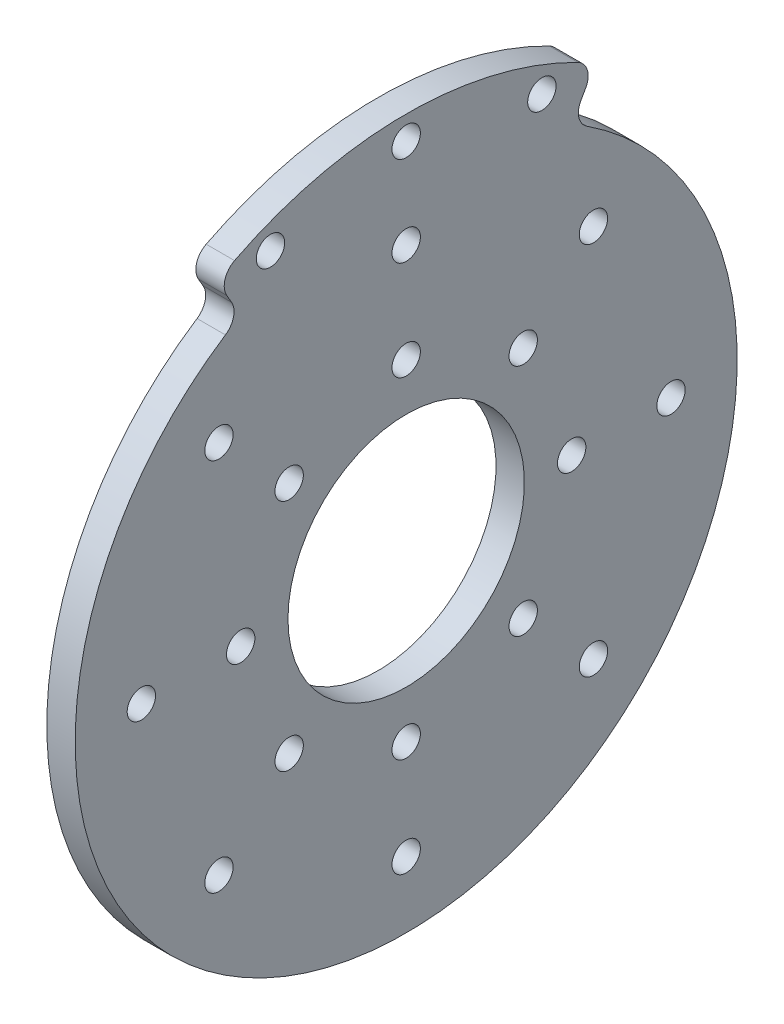
ISO-10303-21;
HEADER;
FILE_DESCRIPTION(('STEP AP214'),'2;1');
FILE_NAME('part.step','',(''),(''),'','','');
FILE_SCHEMA(('AUTOMOTIVE_DESIGN { 1 0 10303 214 1 1 1 1 }'));
ENDSEC;
DATA;
#1=APPLICATION_CONTEXT('core data for automotive mechanical design processes');
#2=APPLICATION_PROTOCOL_DEFINITION('international standard','automotive_design',2000,#1);
#3=PRODUCT_CONTEXT('',#1,'mechanical');
#4=PRODUCT('Part','Part','',(#3));
#5=PRODUCT_RELATED_PRODUCT_CATEGORY('part','',(#4));
#6=PRODUCT_DEFINITION_FORMATION('','',#4);
#7=PRODUCT_DEFINITION_CONTEXT('part definition',#1,'design');
#8=PRODUCT_DEFINITION('design','',#6,#7);
#9=PRODUCT_DEFINITION_SHAPE('','',#8);
#10=(LENGTH_UNIT() NAMED_UNIT(*) SI_UNIT(.MILLI.,.METRE.));
#11=(NAMED_UNIT(*) PLANE_ANGLE_UNIT() SI_UNIT($,.RADIAN.));
#12=(NAMED_UNIT(*) SI_UNIT($,.STERADIAN.) SOLID_ANGLE_UNIT());
#13=UNCERTAINTY_MEASURE_WITH_UNIT(LENGTH_MEASURE(1.E-05),#10,'distance_accuracy_value','');
#14=(GEOMETRIC_REPRESENTATION_CONTEXT(3) GLOBAL_UNCERTAINTY_ASSIGNED_CONTEXT((#13)) GLOBAL_UNIT_ASSIGNED_CONTEXT((#10,
#11,#12)) REPRESENTATION_CONTEXT('',''));
#15=CARTESIAN_POINT('',(0.,0.,0.));
#16=DIRECTION('',(0.,0.,1.));
#17=DIRECTION('',(1.,0.,0.));
#18=AXIS2_PLACEMENT_3D('',#15,#16,#17);
#19=CARTESIAN_POINT('',(0.,33.86335345031,-17.2416151534414));
#20=DIRECTION('',(1.,0.,0.));
#21=DIRECTION('',(0.,0.,-1.));
#22=AXIS2_PLACEMENT_3D('',#19,#20,#21);
#23=CYLINDRICAL_SURFACE('',#22,2.);
#24=DIRECTION('',(1.,0.,0.));
#25=VECTOR('',#24,1.);
#26=CARTESIAN_POINT('',(0.,35.6456352108526,-18.1490685825699));
#27=LINE('',#26,#25);
#28=CARTESIAN_POINT('',(3.,35.6456352108526,-18.1490685825699));
#29=VERTEX_POINT('',#28);
#30=CARTESIAN_POINT('',(0.,35.6456352108526,-18.1490685825699));
#31=VERTEX_POINT('',#30);
#32=EDGE_CURVE('E179',#29,#31,#27,.F.);
#33=ORIENTED_EDGE('',*,*,#32,.F.);
#34=CARTESIAN_POINT('',(3.,33.86335345031,-17.2416151534414));
#35=DIRECTION('',(1.,0.,0.));
#36=DIRECTION('',(0.,0.,-1.));
#37=AXIS2_PLACEMENT_3D('',#34,#35,#36);
#38=CIRCLE('',#37,2.);
#39=CARTESIAN_POINT('',(3.,32.86335345031,-18.9736659610103));
#40=VERTEX_POINT('',#39);
#41=EDGE_CURVE('E55',#40,#29,#38,.T.);
#42=ORIENTED_EDGE('',*,*,#41,.F.);
#43=DIRECTION('',(1.,0.,0.));
#44=VECTOR('',#43,1.);
#45=CARTESIAN_POINT('',(0.,32.8633534503099,-18.9736659610103));
#46=LINE('',#45,#44);
#47=CARTESIAN_POINT('',(0.,32.86335345031,-18.9736659610103));
#48=VERTEX_POINT('',#47);
#49=EDGE_CURVE('E182',#48,#40,#46,.T.);
#50=ORIENTED_EDGE('',*,*,#49,.F.);
#51=CARTESIAN_POINT('',(0.,33.86335345031,-17.2416151534414));
#52=DIRECTION('',(1.,0.,0.));
#53=DIRECTION('',(0.,0.,-1.));
#54=AXIS2_PLACEMENT_3D('',#51,#52,#53);
#55=CIRCLE('',#54,2.);
#56=EDGE_CURVE('E11',#31,#48,#55,.F.);
#57=ORIENTED_EDGE('',*,*,#56,.F.);
#58=EDGE_LOOP('',(#33,#42,#50,#57));
#59=FACE_BOUND('',#58,.T.);
#60=ADVANCED_FACE('F47',(#59),#23,.T.);
#61=CARTESIAN_POINT('',(3.,30.9960935115523,-20.2050040094801));
#62=DIRECTION('',(-1.,0.,0.));
#63=DIRECTION('',(0.,0.,1.));
#64=AXIS2_PLACEMENT_3D('',#61,#62,#63);
#65=CYLINDRICAL_SURFACE('',#64,2.);
#66=DIRECTION('',(-1.,0.,0.));
#67=VECTOR('',#66,1.);
#68=CARTESIAN_POINT('',(0.,31.9960935115523,-18.4729532019112));
#69=LINE('',#68,#67);
#70=CARTESIAN_POINT('',(3.,31.9960935115523,-18.4729532019112));
#71=VERTEX_POINT('',#70);
#72=CARTESIAN_POINT('',(0.,31.9960935115523,-18.4729532019112));
#73=VERTEX_POINT('',#72);
#74=EDGE_CURVE('E165',#71,#73,#69,.T.);
#75=ORIENTED_EDGE('',*,*,#74,.F.);
#76=CARTESIAN_POINT('',(3.,30.9960935115523,-20.2050040094801));
#77=DIRECTION('',(1.,0.,0.));
#78=DIRECTION('',(0.,0.,-1.));
#79=AXIS2_PLACEMENT_3D('',#76,#77,#78);
#80=CIRCLE('',#79,2.);
#81=CARTESIAN_POINT('',(3.,29.3206289974143,-19.1128416305893));
#82=VERTEX_POINT('',#81);
#83=EDGE_CURVE('E173',#71,#82,#80,.T.);
#84=ORIENTED_EDGE('',*,*,#83,.T.);
#85=DIRECTION('',(-1.,0.,0.));
#86=VECTOR('',#85,1.);
#87=CARTESIAN_POINT('',(3.,29.3206289974143,-19.1128416305893));
#88=LINE('',#87,#86);
#89=CARTESIAN_POINT('',(0.,29.3206289974143,-19.1128416305893));
#90=VERTEX_POINT('',#89);
#91=EDGE_CURVE('E169',#90,#82,#88,.F.);
#92=ORIENTED_EDGE('',*,*,#91,.F.);
#93=CARTESIAN_POINT('',(0.,30.9960935115523,-20.2050040094801));
#94=DIRECTION('',(1.,0.,0.));
#95=DIRECTION('',(0.,0.,-1.));
#96=AXIS2_PLACEMENT_3D('',#93,#94,#95);
#97=CIRCLE('',#96,2.);
#98=EDGE_CURVE('E176',#90,#73,#97,.F.);
#99=ORIENTED_EDGE('',*,*,#98,.T.);
#100=EDGE_LOOP('',(#75,#84,#92,#99));
#101=FACE_BOUND('',#100,.T.);
#102=ADVANCED_FACE('F361',(#101),#65,.F.);
#103=CARTESIAN_POINT('',(3.,30.9960935115523,20.2050040094801));
#104=DIRECTION('',(-1.,0.,0.));
#105=DIRECTION('',(0.,0.,1.));
#106=AXIS2_PLACEMENT_3D('',#103,#104,#105);
#107=CYLINDRICAL_SURFACE('',#106,2.);
#108=DIRECTION('',(1.,0.,0.));
#109=VECTOR('',#108,1.);
#110=CARTESIAN_POINT('',(3.,31.9960935115523,18.4729532019112));
#111=LINE('',#110,#109);
#112=CARTESIAN_POINT('',(0.,31.9960935115523,18.4729532019112));
#113=VERTEX_POINT('',#112);
#114=CARTESIAN_POINT('',(3.,31.9960935115523,18.4729532019112));
#115=VERTEX_POINT('',#114);
#116=EDGE_CURVE('E133',#113,#115,#111,.T.);
#117=ORIENTED_EDGE('',*,*,#116,.F.);
#118=CARTESIAN_POINT('',(0.,30.9960935115523,20.2050040094801));
#119=DIRECTION('',(1.,0.,0.));
#120=DIRECTION('',(0.,0.,-1.));
#121=AXIS2_PLACEMENT_3D('',#118,#119,#120);
#122=CIRCLE('',#121,2.);
#123=CARTESIAN_POINT('',(0.,29.3206289974143,19.1128416305893));
#124=VERTEX_POINT('',#123);
#125=EDGE_CURVE('E159',#113,#124,#122,.F.);
#126=ORIENTED_EDGE('',*,*,#125,.T.);
#127=DIRECTION('',(-1.,0.,0.));
#128=VECTOR('',#127,1.);
#129=CARTESIAN_POINT('',(3.,29.3206289974143,19.1128416305893));
#130=LINE('',#129,#128);
#131=CARTESIAN_POINT('',(3.,29.3206289974143,19.1128416305893));
#132=VERTEX_POINT('',#131);
#133=EDGE_CURVE('E155',#132,#124,#130,.T.);
#134=ORIENTED_EDGE('',*,*,#133,.F.);
#135=CARTESIAN_POINT('',(3.,30.9960935115523,20.2050040094801));
#136=DIRECTION('',(1.,0.,0.));
#137=DIRECTION('',(0.,0.,-1.));
#138=AXIS2_PLACEMENT_3D('',#135,#136,#137);
#139=CIRCLE('',#138,2.);
#140=EDGE_CURVE('E162',#132,#115,#139,.T.);
#141=ORIENTED_EDGE('',*,*,#140,.T.);
#142=EDGE_LOOP('',(#117,#126,#134,#141));
#143=FACE_BOUND('',#142,.T.);
#144=ADVANCED_FACE('F366',(#143),#107,.F.);
#145=CARTESIAN_POINT('',(0.,33.8633534503099,17.2416151534414));
#146=DIRECTION('',(1.,0.,0.));
#147=DIRECTION('',(0.,0.,-1.));
#148=AXIS2_PLACEMENT_3D('',#145,#146,#147);
#149=CYLINDRICAL_SURFACE('',#148,2.);
#150=DIRECTION('',(1.,0.,0.));
#151=VECTOR('',#150,1.);
#152=CARTESIAN_POINT('',(0.,35.6456352108526,18.1490685825699));
#153=LINE('',#152,#151);
#154=CARTESIAN_POINT('',(0.,35.6456352108526,18.1490685825699));
#155=VERTEX_POINT('',#154);
#156=CARTESIAN_POINT('',(3.,35.6456352108526,18.1490685825699));
#157=VERTEX_POINT('',#156);
#158=EDGE_CURVE('E129',#155,#157,#153,.T.);
#159=ORIENTED_EDGE('',*,*,#158,.F.);
#160=CARTESIAN_POINT('',(0.,33.8633534503099,17.2416151534414));
#161=DIRECTION('',(1.,0.,0.));
#162=DIRECTION('',(0.,0.,-1.));
#163=AXIS2_PLACEMENT_3D('',#160,#161,#162);
#164=CIRCLE('',#163,2.);
#165=CARTESIAN_POINT('',(0.,32.8633534503099,18.9736659610103));
#166=VERTEX_POINT('',#165);
#167=EDGE_CURVE('E134',#166,#155,#164,.F.);
#168=ORIENTED_EDGE('',*,*,#167,.F.);
#169=DIRECTION('',(-1.,0.,0.));
#170=VECTOR('',#169,1.);
#171=CARTESIAN_POINT('',(0.,32.8633534503099,18.9736659610103));
#172=LINE('',#171,#170);
#173=CARTESIAN_POINT('',(3.,32.8633534503099,18.9736659610103));
#174=VERTEX_POINT('',#173);
#175=EDGE_CURVE('E131',#174,#166,#172,.T.);
#176=ORIENTED_EDGE('',*,*,#175,.F.);
#177=CARTESIAN_POINT('',(3.,33.8633534503099,17.2416151534414));
#178=DIRECTION('',(1.,0.,0.));
#179=DIRECTION('',(0.,0.,-1.));
#180=AXIS2_PLACEMENT_3D('',#177,#178,#179);
#181=CIRCLE('',#180,2.);
#182=EDGE_CURVE('E116',#157,#174,#181,.T.);
#183=ORIENTED_EDGE('',*,*,#182,.F.);
#184=EDGE_LOOP('',(#159,#168,#176,#183));
#185=FACE_BOUND('',#184,.T.);
#186=ADVANCED_FACE('F127',(#185),#149,.T.);
#187=CARTESIAN_POINT('',(3.,0.,0.));
#188=DIRECTION('',(-1.,0.,0.));
#189=DIRECTION('',(0.,0.,1.));
#190=AXIS2_PLACEMENT_3D('',#187,#188,#189);
#191=CYLINDRICAL_SURFACE('',#190,35.);
#192=CARTESIAN_POINT('',(0.,0.,0.));
#193=DIRECTION('',(1.,0.,0.));
#194=DIRECTION('',(0.,0.,-1.));
#195=AXIS2_PLACEMENT_3D('',#192,#193,#194);
#196=CIRCLE('',#195,35.);
#197=EDGE_CURVE('E146',#124,#90,#196,.T.);
#198=ORIENTED_EDGE('',*,*,#197,.T.);
#199=ORIENTED_EDGE('',*,*,#91,.T.);
#200=CARTESIAN_POINT('',(3.,0.,0.));
#201=DIRECTION('',(1.,0.,0.));
#202=DIRECTION('',(0.,0.,-1.));
#203=AXIS2_PLACEMENT_3D('',#200,#201,#202);
#204=CIRCLE('',#203,35.);
#205=EDGE_CURVE('E140',#132,#82,#204,.T.);
#206=ORIENTED_EDGE('',*,*,#205,.F.);
#207=ORIENTED_EDGE('',*,*,#133,.T.);
#208=EDGE_LOOP('',(#198,#199,#206,#207));
#209=FACE_BOUND('',#208,.T.);
#210=ADVANCED_FACE('F345',(#209),#191,.T.);
#211=CARTESIAN_POINT('',(3.,0.,0.));
#212=DIRECTION('',(1.,0.,0.));
#213=DIRECTION('',(0.,0.,-1.));
#214=AXIS2_PLACEMENT_3D('',#211,#212,#213);
#215=PLANE('',#214);
#216=CARTESIAN_POINT('',(3.,34.6454824691735,14.3506287136904));
#217=DIRECTION('',(1.,0.,0.));
#218=DIRECTION('',(0.,0.,-1.));
#219=AXIS2_PLACEMENT_3D('',#216,#217,#218);
#220=CIRCLE('',#219,1.5);
#221=CARTESIAN_POINT('',(3.,34.6454824691735,12.8506287136904));
#222=VERTEX_POINT('',#221);
#223=EDGE_CURVE('E196',#222,#222,#220,.T.);
#224=ORIENTED_EDGE('',*,*,#223,.F.);
#225=EDGE_LOOP('',(#224));
#226=FACE_BOUND('',#225,.T.);
#227=CARTESIAN_POINT('',(3.,34.6454824691732,-14.3506287136909));
#228=DIRECTION('',(1.,0.,0.));
#229=DIRECTION('',(0.,0.,-1.));
#230=AXIS2_PLACEMENT_3D('',#227,#228,#229);
#231=CIRCLE('',#230,1.5);
#232=CARTESIAN_POINT('',(3.,34.6454824691732,-15.8506287136909));
#233=VERTEX_POINT('',#232);
#234=EDGE_CURVE('E382',#233,#233,#231,.T.);
#235=ORIENTED_EDGE('',*,*,#234,.F.);
#236=EDGE_LOOP('',(#235));
#237=FACE_BOUND('',#236,.T.);
#238=CARTESIAN_POINT('',(3.,37.5,0.));
#239=DIRECTION('',(1.,0.,0.));
#240=DIRECTION('',(0.,0.,-1.));
#241=AXIS2_PLACEMENT_3D('',#238,#239,#240);
#242=CIRCLE('',#241,1.5);
#243=CARTESIAN_POINT('',(3.,37.5,-1.5));
#244=VERTEX_POINT('',#243);
#245=EDGE_CURVE('E374',#244,#244,#242,.T.);
#246=ORIENTED_EDGE('',*,*,#245,.F.);
#247=EDGE_LOOP('',(#246));
#248=FACE_BOUND('',#247,.T.);
#249=DIRECTION('',(0.,0.866025403784438,-0.500000000000001));
#250=VECTOR('',#249,1.);
#251=CARTESIAN_POINT('',(3.,0.,0.));
#252=LINE('',#251,#250);
#253=EDGE_CURVE('E123',#71,#40,#252,.T.);
#254=ORIENTED_EDGE('',*,*,#253,.T.);
#255=ORIENTED_EDGE('',*,*,#41,.T.);
#256=CARTESIAN_POINT('',(3.,0.,0.));
#257=DIRECTION('',(1.,0.,0.));
#258=DIRECTION('',(0.,0.,-1.));
#259=AXIS2_PLACEMENT_3D('',#256,#257,#258);
#260=CIRCLE('',#259,40.);
#261=EDGE_CURVE('E110',#29,#157,#260,.T.);
#262=ORIENTED_EDGE('',*,*,#261,.T.);
#263=ORIENTED_EDGE('',*,*,#182,.T.);
#264=DIRECTION('',(0.,0.866025403784438,0.500000000000001));
#265=VECTOR('',#264,1.);
#266=CARTESIAN_POINT('',(3.,0.,0.));
#267=LINE('',#266,#265);
#268=EDGE_CURVE('E122',#115,#174,#267,.T.);
#269=ORIENTED_EDGE('',*,*,#268,.F.);
#270=ORIENTED_EDGE('',*,*,#140,.F.);
#271=ORIENTED_EDGE('',*,*,#205,.T.);
#272=ORIENTED_EDGE('',*,*,#83,.F.);
#273=EDGE_LOOP('',(#254,#255,#262,#263,#269,#270,#271,#272));
#274=FACE_BOUND('',#273,.T.);
#275=CARTESIAN_POINT('',(3.,0.,0.));
#276=DIRECTION('',(-1.,0.,0.));
#277=DIRECTION('',(0.,0.,1.));
#278=AXIS2_PLACEMENT_3D('',#275,#276,#277);
#279=CIRCLE('',#278,12.5);
#280=CARTESIAN_POINT('',(3.,0.,12.5));
#281=VERTEX_POINT('',#280);
#282=EDGE_CURVE('E204',#281,#281,#279,.T.);
#283=ORIENTED_EDGE('',*,*,#282,.T.);
#284=EDGE_LOOP('',(#283));
#285=FACE_BOUND('',#284,.T.);
#286=CARTESIAN_POINT('',(3.,17.5,0.));
#287=DIRECTION('',(1.,0.,0.));
#288=DIRECTION('',(0.,0.,-1.));
#289=AXIS2_PLACEMENT_3D('',#286,#287,#288);
#290=CIRCLE('',#289,1.5);
#291=CARTESIAN_POINT('',(3.,17.5,-1.5));
#292=VERTEX_POINT('',#291);
#293=EDGE_CURVE('E237',#292,#292,#290,.T.);
#294=ORIENTED_EDGE('',*,*,#293,.F.);
#295=EDGE_LOOP('',(#294));
#296=FACE_BOUND('',#295,.T.);
#297=CARTESIAN_POINT('',(3.,12.3743686707646,-12.3743686707646));
#298=DIRECTION('',(1.,0.,0.));
#299=DIRECTION('',(0.,0.,-1.));
#300=AXIS2_PLACEMENT_3D('',#297,#298,#299);
#301=CIRCLE('',#300,1.5);
#302=CARTESIAN_POINT('',(3.,12.3743686707646,-13.8743686707646));
#303=VERTEX_POINT('',#302);
#304=EDGE_CURVE('E246',#303,#303,#301,.T.);
#305=ORIENTED_EDGE('',*,*,#304,.F.);
#306=EDGE_LOOP('',(#305));
#307=FACE_BOUND('',#306,.T.);
#308=CARTESIAN_POINT('',(3.,0.,-17.5));
#309=DIRECTION('',(1.,0.,0.));
#310=DIRECTION('',(0.,0.,-1.));
#311=AXIS2_PLACEMENT_3D('',#308,#309,#310);
#312=CIRCLE('',#311,1.5);
#313=CARTESIAN_POINT('',(3.,0.,-19.));
#314=VERTEX_POINT('',#313);
#315=EDGE_CURVE('E254',#314,#314,#312,.T.);
#316=ORIENTED_EDGE('',*,*,#315,.F.);
#317=EDGE_LOOP('',(#316));
#318=FACE_BOUND('',#317,.T.);
#319=CARTESIAN_POINT('',(3.,-12.3743686707646,-12.3743686707645));
#320=DIRECTION('',(1.,0.,0.));
#321=DIRECTION('',(0.,0.,-1.));
#322=AXIS2_PLACEMENT_3D('',#319,#320,#321);
#323=CIRCLE('',#322,1.5);
#324=CARTESIAN_POINT('',(3.,-12.3743686707646,-13.8743686707645));
#325=VERTEX_POINT('',#324);
#326=EDGE_CURVE('E262',#325,#325,#323,.T.);
#327=ORIENTED_EDGE('',*,*,#326,.F.);
#328=EDGE_LOOP('',(#327));
#329=FACE_BOUND('',#328,.T.);
#330=CARTESIAN_POINT('',(3.,-17.5,1.2220184685951E-13));
#331=DIRECTION('',(1.,0.,0.));
#332=DIRECTION('',(0.,0.,-1.));
#333=AXIS2_PLACEMENT_3D('',#330,#331,#332);
#334=CIRCLE('',#333,1.5);
#335=CARTESIAN_POINT('',(3.,-17.5,-1.49999999999988));
#336=VERTEX_POINT('',#335);
#337=EDGE_CURVE('E213',#336,#336,#334,.T.);
#338=ORIENTED_EDGE('',*,*,#337,.F.);
#339=EDGE_LOOP('',(#338));
#340=FACE_BOUND('',#339,.T.);
#341=CARTESIAN_POINT('',(3.,-12.3743686707645,12.3743686707647));
#342=DIRECTION('',(1.,0.,0.));
#343=DIRECTION('',(0.,0.,-1.));
#344=AXIS2_PLACEMENT_3D('',#341,#342,#343);
#345=CIRCLE('',#344,1.5);
#346=CARTESIAN_POINT('',(3.,-12.3743686707645,10.8743686707647));
#347=VERTEX_POINT('',#346);
#348=EDGE_CURVE('E222',#347,#347,#345,.T.);
#349=ORIENTED_EDGE('',*,*,#348,.F.);
#350=EDGE_LOOP('',(#349));
#351=FACE_BOUND('',#350,.T.);
#352=CARTESIAN_POINT('',(3.,1.83302770289265E-13,17.5));
#353=DIRECTION('',(1.,0.,0.));
#354=DIRECTION('',(0.,0.,-1.));
#355=AXIS2_PLACEMENT_3D('',#352,#353,#354);
#356=CIRCLE('',#355,1.5);
#357=CARTESIAN_POINT('',(3.,1.83302770289265E-13,16.));
#358=VERTEX_POINT('',#357);
#359=EDGE_CURVE('E230',#358,#358,#356,.T.);
#360=ORIENTED_EDGE('',*,*,#359,.F.);
#361=EDGE_LOOP('',(#360));
#362=FACE_BOUND('',#361,.T.);
#363=CARTESIAN_POINT('',(3.,12.3743686707647,12.3743686707644));
#364=DIRECTION('',(1.,0.,0.));
#365=DIRECTION('',(0.,0.,-1.));
#366=AXIS2_PLACEMENT_3D('',#363,#364,#365);
#367=CIRCLE('',#366,1.5);
#368=CARTESIAN_POINT('',(3.,12.3743686707647,10.8743686707644));
#369=VERTEX_POINT('',#368);
#370=EDGE_CURVE('E241',#369,#369,#367,.T.);
#371=ORIENTED_EDGE('',*,*,#370,.F.);
#372=EDGE_LOOP('',(#371));
#373=FACE_BOUND('',#372,.T.);
#374=CARTESIAN_POINT('',(3.,-19.7989898732234,-19.7989898732232));
#375=DIRECTION('',(1.,0.,0.));
#376=DIRECTION('',(0.,0.,-1.));
#377=AXIS2_PLACEMENT_3D('',#374,#375,#376);
#378=CIRCLE('',#377,1.5);
#379=CARTESIAN_POINT('',(3.,-19.7989898732234,-21.2989898732232));
#380=VERTEX_POINT('',#379);
#381=EDGE_CURVE('E301',#380,#380,#378,.T.);
#382=ORIENTED_EDGE('',*,*,#381,.F.);
#383=EDGE_LOOP('',(#382));
#384=FACE_BOUND('',#383,.T.);
#385=CARTESIAN_POINT('',(3.,-28.,1.95522954975215E-13));
#386=DIRECTION('',(1.,0.,0.));
#387=DIRECTION('',(0.,0.,-1.));
#388=AXIS2_PLACEMENT_3D('',#385,#386,#387);
#389=CIRCLE('',#388,1.5);
#390=CARTESIAN_POINT('',(3.,-28.,-1.4999999999998));
#391=VERTEX_POINT('',#390);
#392=EDGE_CURVE('E310',#391,#391,#389,.T.);
#393=ORIENTED_EDGE('',*,*,#392,.F.);
#394=EDGE_LOOP('',(#393));
#395=FACE_BOUND('',#394,.T.);
#396=CARTESIAN_POINT('',(3.,-19.7989898732232,19.7989898732235));
#397=DIRECTION('',(1.,0.,0.));
#398=DIRECTION('',(0.,0.,-1.));
#399=AXIS2_PLACEMENT_3D('',#396,#397,#398);
#400=CIRCLE('',#399,1.5);
#401=CARTESIAN_POINT('',(3.,-19.7989898732232,18.2989898732235));
#402=VERTEX_POINT('',#401);
#403=EDGE_CURVE('E318',#402,#402,#400,.T.);
#404=ORIENTED_EDGE('',*,*,#403,.F.);
#405=EDGE_LOOP('',(#404));
#406=FACE_BOUND('',#405,.T.);
#407=CARTESIAN_POINT('',(3.,2.93284432462823E-13,28.));
#408=DIRECTION('',(1.,0.,0.));
#409=DIRECTION('',(0.,0.,-1.));
#410=AXIS2_PLACEMENT_3D('',#407,#408,#409);
#411=CIRCLE('',#410,1.5);
#412=CARTESIAN_POINT('',(3.,2.93284432462823E-13,26.5));
#413=VERTEX_POINT('',#412);
#414=EDGE_CURVE('E326',#413,#413,#411,.T.);
#415=ORIENTED_EDGE('',*,*,#414,.F.);
#416=EDGE_LOOP('',(#415));
#417=FACE_BOUND('',#416,.T.);
#418=CARTESIAN_POINT('',(3.,28.,0.));
#419=DIRECTION('',(1.,0.,0.));
#420=DIRECTION('',(0.,0.,-1.));
#421=AXIS2_PLACEMENT_3D('',#418,#419,#420);
#422=CIRCLE('',#421,1.5);
#423=CARTESIAN_POINT('',(3.,28.,-1.5));
#424=VERTEX_POINT('',#423);
#425=EDGE_CURVE('E277',#424,#424,#422,.T.);
#426=ORIENTED_EDGE('',*,*,#425,.F.);
#427=EDGE_LOOP('',(#426));
#428=FACE_BOUND('',#427,.T.);
#429=CARTESIAN_POINT('',(3.,19.7989898732233,-19.7989898732234));
#430=DIRECTION('',(1.,0.,0.));
#431=DIRECTION('',(0.,0.,-1.));
#432=AXIS2_PLACEMENT_3D('',#429,#430,#431);
#433=CIRCLE('',#432,1.5);
#434=CARTESIAN_POINT('',(3.,19.7989898732233,-21.2989898732234));
#435=VERTEX_POINT('',#434);
#436=EDGE_CURVE('E286',#435,#435,#433,.T.);
#437=ORIENTED_EDGE('',*,*,#436,.F.);
#438=EDGE_LOOP('',(#437));
#439=FACE_BOUND('',#438,.T.);
#440=CARTESIAN_POINT('',(3.,0.,-28.));
#441=DIRECTION('',(1.,0.,0.));
#442=DIRECTION('',(0.,0.,-1.));
#443=AXIS2_PLACEMENT_3D('',#440,#441,#442);
#444=CIRCLE('',#443,1.5);
#445=CARTESIAN_POINT('',(3.,0.,-29.5));
#446=VERTEX_POINT('',#445);
#447=EDGE_CURVE('E294',#446,#446,#444,.T.);
#448=ORIENTED_EDGE('',*,*,#447,.F.);
#449=EDGE_LOOP('',(#448));
#450=FACE_BOUND('',#449,.T.);
#451=CARTESIAN_POINT('',(3.,19.7989898732236,19.7989898732231));
#452=DIRECTION('',(1.,0.,0.));
#453=DIRECTION('',(0.,0.,-1.));
#454=AXIS2_PLACEMENT_3D('',#451,#452,#453);
#455=CIRCLE('',#454,1.5);
#456=CARTESIAN_POINT('',(3.,19.7989898732236,18.2989898732231));
#457=VERTEX_POINT('',#456);
#458=EDGE_CURVE('E305',#457,#457,#455,.T.);
#459=ORIENTED_EDGE('',*,*,#458,.F.);
#460=EDGE_LOOP('',(#459));
#461=FACE_BOUND('',#460,.T.);
#462=ADVANCED_FACE('F113',(#226,#237,#248,#274,#285,#296,#307,#318,#329,#340,#351,#362,#373,
#384,#395,#406,#417,#428,#439,#450,#461),#215,.T.);
#463=CARTESIAN_POINT('',(0.,0.,0.));
#464=DIRECTION('',(1.,0.,0.));
#465=DIRECTION('',(0.,0.,-1.));
#466=AXIS2_PLACEMENT_3D('',#463,#464,#465);
#467=PLANE('',#466);
#468=CARTESIAN_POINT('',(0.,34.6454824691735,14.3506287136904));
#469=DIRECTION('',(1.,0.,0.));
#470=DIRECTION('',(0.,0.,-1.));
#471=AXIS2_PLACEMENT_3D('',#468,#469,#470);
#472=CIRCLE('',#471,1.5);
#473=CARTESIAN_POINT('',(0.,34.6454824691735,12.8506287136904));
#474=VERTEX_POINT('',#473);
#475=EDGE_CURVE('E192',#474,#474,#472,.T.);
#476=ORIENTED_EDGE('',*,*,#475,.T.);
#477=EDGE_LOOP('',(#476));
#478=FACE_BOUND('',#477,.T.);
#479=CARTESIAN_POINT('',(0.,34.6454824691732,-14.3506287136909));
#480=DIRECTION('',(1.,0.,0.));
#481=DIRECTION('',(0.,0.,-1.));
#482=AXIS2_PLACEMENT_3D('',#479,#480,#481);
#483=CIRCLE('',#482,1.5);
#484=CARTESIAN_POINT('',(0.,34.6454824691732,-15.8506287136909));
#485=VERTEX_POINT('',#484);
#486=EDGE_CURVE('E386',#485,#485,#483,.T.);
#487=ORIENTED_EDGE('',*,*,#486,.T.);
#488=EDGE_LOOP('',(#487));
#489=FACE_BOUND('',#488,.T.);
#490=CARTESIAN_POINT('',(0.,37.5,0.));
#491=DIRECTION('',(1.,0.,0.));
#492=DIRECTION('',(0.,0.,-1.));
#493=AXIS2_PLACEMENT_3D('',#490,#491,#492);
#494=CIRCLE('',#493,1.5);
#495=CARTESIAN_POINT('',(0.,37.5,-1.5));
#496=VERTEX_POINT('',#495);
#497=EDGE_CURVE('E378',#496,#496,#494,.T.);
#498=ORIENTED_EDGE('',*,*,#497,.T.);
#499=EDGE_LOOP('',(#498));
#500=FACE_BOUND('',#499,.T.);
#501=CARTESIAN_POINT('',(0.,0.,0.));
#502=DIRECTION('',(1.,0.,0.));
#503=DIRECTION('',(0.,0.,-1.));
#504=AXIS2_PLACEMENT_3D('',#501,#502,#503);
#505=CIRCLE('',#504,40.);
#506=EDGE_CURVE('E137',#31,#155,#505,.T.);
#507=ORIENTED_EDGE('',*,*,#506,.F.);
#508=ORIENTED_EDGE('',*,*,#56,.T.);
#509=DIRECTION('',(0.,0.866025403784438,-0.500000000000001));
#510=VECTOR('',#509,1.);
#511=CARTESIAN_POINT('',(0.,0.,0.));
#512=LINE('',#511,#510);
#513=EDGE_CURVE('E189',#73,#48,#512,.T.);
#514=ORIENTED_EDGE('',*,*,#513,.F.);
#515=ORIENTED_EDGE('',*,*,#98,.F.);
#516=ORIENTED_EDGE('',*,*,#197,.F.);
#517=ORIENTED_EDGE('',*,*,#125,.F.);
#518=DIRECTION('',(0.,0.866025403784438,0.500000000000001));
#519=VECTOR('',#518,1.);
#520=CARTESIAN_POINT('',(0.,0.,0.));
#521=LINE('',#520,#519);
#522=EDGE_CURVE('E199',#113,#166,#521,.T.);
#523=ORIENTED_EDGE('',*,*,#522,.T.);
#524=ORIENTED_EDGE('',*,*,#167,.T.);
#525=EDGE_LOOP('',(#507,#508,#514,#515,#516,#517,#523,#524));
#526=FACE_BOUND('',#525,.T.);
#527=CARTESIAN_POINT('',(0.,0.,0.));
#528=DIRECTION('',(-1.,0.,0.));
#529=DIRECTION('',(0.,0.,1.));
#530=AXIS2_PLACEMENT_3D('',#527,#528,#529);
#531=CIRCLE('',#530,12.5);
#532=CARTESIAN_POINT('',(0.,0.,12.5));
#533=VERTEX_POINT('',#532);
#534=EDGE_CURVE('E209',#533,#533,#531,.T.);
#535=ORIENTED_EDGE('',*,*,#534,.F.);
#536=EDGE_LOOP('',(#535));
#537=FACE_BOUND('',#536,.T.);
#538=CARTESIAN_POINT('',(0.,17.5,0.));
#539=DIRECTION('',(1.,0.,0.));
#540=DIRECTION('',(0.,0.,-1.));
#541=AXIS2_PLACEMENT_3D('',#538,#539,#540);
#542=CIRCLE('',#541,1.5);
#543=CARTESIAN_POINT('',(0.,17.5,-1.5));
#544=VERTEX_POINT('',#543);
#545=EDGE_CURVE('E242',#544,#544,#542,.T.);
#546=ORIENTED_EDGE('',*,*,#545,.T.);
#547=EDGE_LOOP('',(#546));
#548=FACE_BOUND('',#547,.T.);
#549=CARTESIAN_POINT('',(0.,12.3743686707646,-12.3743686707646));
#550=DIRECTION('',(1.,0.,0.));
#551=DIRECTION('',(0.,0.,-1.));
#552=AXIS2_PLACEMENT_3D('',#549,#550,#551);
#553=CIRCLE('',#552,1.5);
#554=CARTESIAN_POINT('',(0.,12.3743686707646,-13.8743686707646));
#555=VERTEX_POINT('',#554);
#556=EDGE_CURVE('E250',#555,#555,#553,.T.);
#557=ORIENTED_EDGE('',*,*,#556,.T.);
#558=EDGE_LOOP('',(#557));
#559=FACE_BOUND('',#558,.T.);
#560=CARTESIAN_POINT('',(0.,0.,-17.5));
#561=DIRECTION('',(1.,0.,0.));
#562=DIRECTION('',(0.,0.,-1.));
#563=AXIS2_PLACEMENT_3D('',#560,#561,#562);
#564=CIRCLE('',#563,1.5);
#565=CARTESIAN_POINT('',(0.,0.,-19.));
#566=VERTEX_POINT('',#565);
#567=EDGE_CURVE('E258',#566,#566,#564,.T.);
#568=ORIENTED_EDGE('',*,*,#567,.T.);
#569=EDGE_LOOP('',(#568));
#570=FACE_BOUND('',#569,.T.);
#571=CARTESIAN_POINT('',(0.,-12.3743686707646,-12.3743686707645));
#572=DIRECTION('',(1.,0.,0.));
#573=DIRECTION('',(0.,0.,-1.));
#574=AXIS2_PLACEMENT_3D('',#571,#572,#573);
#575=CIRCLE('',#574,1.5);
#576=CARTESIAN_POINT('',(0.,-12.3743686707646,-13.8743686707645));
#577=VERTEX_POINT('',#576);
#578=EDGE_CURVE('E217',#577,#577,#575,.T.);
#579=ORIENTED_EDGE('',*,*,#578,.T.);
#580=EDGE_LOOP('',(#579));
#581=FACE_BOUND('',#580,.T.);
#582=CARTESIAN_POINT('',(0.,-17.5,1.2220184685951E-13));
#583=DIRECTION('',(1.,0.,0.));
#584=DIRECTION('',(0.,0.,-1.));
#585=AXIS2_PLACEMENT_3D('',#582,#583,#584);
#586=CIRCLE('',#585,1.5);
#587=CARTESIAN_POINT('',(0.,-17.5,-1.49999999999988));
#588=VERTEX_POINT('',#587);
#589=EDGE_CURVE('E218',#588,#588,#586,.T.);
#590=ORIENTED_EDGE('',*,*,#589,.T.);
#591=EDGE_LOOP('',(#590));
#592=FACE_BOUND('',#591,.T.);
#593=CARTESIAN_POINT('',(0.,-12.3743686707645,12.3743686707647));
#594=DIRECTION('',(1.,0.,0.));
#595=DIRECTION('',(0.,0.,-1.));
#596=AXIS2_PLACEMENT_3D('',#593,#594,#595);
#597=CIRCLE('',#596,1.5);
#598=CARTESIAN_POINT('',(0.,-12.3743686707645,10.8743686707647));
#599=VERTEX_POINT('',#598);
#600=EDGE_CURVE('E226',#599,#599,#597,.T.);
#601=ORIENTED_EDGE('',*,*,#600,.T.);
#602=EDGE_LOOP('',(#601));
#603=FACE_BOUND('',#602,.T.);
#604=CARTESIAN_POINT('',(0.,1.83302770289265E-13,17.5));
#605=DIRECTION('',(1.,0.,0.));
#606=DIRECTION('',(0.,0.,-1.));
#607=AXIS2_PLACEMENT_3D('',#604,#605,#606);
#608=CIRCLE('',#607,1.5);
#609=CARTESIAN_POINT('',(0.,1.83302770289265E-13,16.));
#610=VERTEX_POINT('',#609);
#611=EDGE_CURVE('E208',#610,#610,#608,.T.);
#612=ORIENTED_EDGE('',*,*,#611,.T.);
#613=EDGE_LOOP('',(#612));
#614=FACE_BOUND('',#613,.T.);
#615=CARTESIAN_POINT('',(0.,12.3743686707647,12.3743686707644));
#616=DIRECTION('',(1.,0.,0.));
#617=DIRECTION('',(0.,0.,-1.));
#618=AXIS2_PLACEMENT_3D('',#615,#616,#617);
#619=CIRCLE('',#618,1.5);
#620=CARTESIAN_POINT('',(0.,12.3743686707647,10.8743686707644));
#621=VERTEX_POINT('',#620);
#622=EDGE_CURVE('E269',#621,#621,#619,.T.);
#623=ORIENTED_EDGE('',*,*,#622,.T.);
#624=EDGE_LOOP('',(#623));
#625=FACE_BOUND('',#624,.T.);
#626=CARTESIAN_POINT('',(0.,-19.7989898732234,-19.7989898732232));
#627=DIRECTION('',(1.,0.,0.));
#628=DIRECTION('',(0.,0.,-1.));
#629=AXIS2_PLACEMENT_3D('',#626,#627,#628);
#630=CIRCLE('',#629,1.5);
#631=CARTESIAN_POINT('',(0.,-19.7989898732234,-21.2989898732232));
#632=VERTEX_POINT('',#631);
#633=EDGE_CURVE('E306',#632,#632,#630,.T.);
#634=ORIENTED_EDGE('',*,*,#633,.T.);
#635=EDGE_LOOP('',(#634));
#636=FACE_BOUND('',#635,.T.);
#637=CARTESIAN_POINT('',(0.,-28.,1.95522954975215E-13));
#638=DIRECTION('',(1.,0.,0.));
#639=DIRECTION('',(0.,0.,-1.));
#640=AXIS2_PLACEMENT_3D('',#637,#638,#639);
#641=CIRCLE('',#640,1.5);
#642=CARTESIAN_POINT('',(0.,-28.,-1.4999999999998));
#643=VERTEX_POINT('',#642);
#644=EDGE_CURVE('E314',#643,#643,#641,.T.);
#645=ORIENTED_EDGE('',*,*,#644,.T.);
#646=EDGE_LOOP('',(#645));
#647=FACE_BOUND('',#646,.T.);
#648=CARTESIAN_POINT('',(0.,-19.7989898732232,19.7989898732235));
#649=DIRECTION('',(1.,0.,0.));
#650=DIRECTION('',(0.,0.,-1.));
#651=AXIS2_PLACEMENT_3D('',#648,#649,#650);
#652=CIRCLE('',#651,1.5);
#653=CARTESIAN_POINT('',(0.,-19.7989898732232,18.2989898732235));
#654=VERTEX_POINT('',#653);
#655=EDGE_CURVE('E322',#654,#654,#652,.T.);
#656=ORIENTED_EDGE('',*,*,#655,.T.);
#657=EDGE_LOOP('',(#656));
#658=FACE_BOUND('',#657,.T.);
#659=CARTESIAN_POINT('',(0.,2.93284432462823E-13,28.));
#660=DIRECTION('',(1.,0.,0.));
#661=DIRECTION('',(0.,0.,-1.));
#662=AXIS2_PLACEMENT_3D('',#659,#660,#661);
#663=CIRCLE('',#662,1.5);
#664=CARTESIAN_POINT('',(0.,2.93284432462823E-13,26.5));
#665=VERTEX_POINT('',#664);
#666=EDGE_CURVE('E281',#665,#665,#663,.T.);
#667=ORIENTED_EDGE('',*,*,#666,.T.);
#668=EDGE_LOOP('',(#667));
#669=FACE_BOUND('',#668,.T.);
#670=CARTESIAN_POINT('',(0.,28.,0.));
#671=DIRECTION('',(1.,0.,0.));
#672=DIRECTION('',(0.,0.,-1.));
#673=AXIS2_PLACEMENT_3D('',#670,#671,#672);
#674=CIRCLE('',#673,1.5);
#675=CARTESIAN_POINT('',(0.,28.,-1.5));
#676=VERTEX_POINT('',#675);
#677=EDGE_CURVE('E282',#676,#676,#674,.T.);
#678=ORIENTED_EDGE('',*,*,#677,.T.);
#679=EDGE_LOOP('',(#678));
#680=FACE_BOUND('',#679,.T.);
#681=CARTESIAN_POINT('',(0.,19.7989898732233,-19.7989898732234));
#682=DIRECTION('',(1.,0.,0.));
#683=DIRECTION('',(0.,0.,-1.));
#684=AXIS2_PLACEMENT_3D('',#681,#682,#683);
#685=CIRCLE('',#684,1.5);
#686=CARTESIAN_POINT('',(0.,19.7989898732233,-21.2989898732234));
#687=VERTEX_POINT('',#686);
#688=EDGE_CURVE('E290',#687,#687,#685,.T.);
#689=ORIENTED_EDGE('',*,*,#688,.T.);
#690=EDGE_LOOP('',(#689));
#691=FACE_BOUND('',#690,.T.);
#692=CARTESIAN_POINT('',(0.,0.,-28.));
#693=DIRECTION('',(1.,0.,0.));
#694=DIRECTION('',(0.,0.,-1.));
#695=AXIS2_PLACEMENT_3D('',#692,#693,#694);
#696=CIRCLE('',#695,1.5);
#697=CARTESIAN_POINT('',(0.,0.,-29.5));
#698=VERTEX_POINT('',#697);
#699=EDGE_CURVE('E273',#698,#698,#696,.T.);
#700=ORIENTED_EDGE('',*,*,#699,.T.);
#701=EDGE_LOOP('',(#700));
#702=FACE_BOUND('',#701,.T.);
#703=CARTESIAN_POINT('',(0.,19.7989898732236,19.7989898732231));
#704=DIRECTION('',(1.,0.,0.));
#705=DIRECTION('',(0.,0.,-1.));
#706=AXIS2_PLACEMENT_3D('',#703,#704,#705);
#707=CIRCLE('',#706,1.5);
#708=CARTESIAN_POINT('',(0.,19.7989898732236,18.2989898732231));
#709=VERTEX_POINT('',#708);
#710=EDGE_CURVE('E333',#709,#709,#707,.T.);
#711=ORIENTED_EDGE('',*,*,#710,.T.);
#712=EDGE_LOOP('',(#711));
#713=FACE_BOUND('',#712,.T.);
#714=ADVANCED_FACE('F344',(#478,#489,#500,#526,#537,#548,#559,#570,#581,#592,#603,#614,#625,
#636,#647,#658,#669,#680,#691,#702,#713),#467,.F.);
#715=CARTESIAN_POINT('',(0.,19.7989898732236,19.7989898732231));
#716=DIRECTION('',(1.,0.,0.));
#717=DIRECTION('',(0.,0.,-1.));
#718=AXIS2_PLACEMENT_3D('',#715,#716,#717);
#719=CYLINDRICAL_SURFACE('',#718,1.5);
#720=ORIENTED_EDGE('',*,*,#710,.F.);
#721=EDGE_LOOP('',(#720));
#722=FACE_BOUND('',#721,.T.);
#723=ORIENTED_EDGE('',*,*,#458,.T.);
#724=EDGE_LOOP('',(#723));
#725=FACE_BOUND('',#724,.T.);
#726=ADVANCED_FACE('F341',(#722,#725),#719,.F.);
#727=CARTESIAN_POINT('',(0.,0.,-28.));
#728=DIRECTION('',(1.,0.,0.));
#729=DIRECTION('',(0.,0.,-1.));
#730=AXIS2_PLACEMENT_3D('',#727,#728,#729);
#731=CYLINDRICAL_SURFACE('',#730,1.5);
#732=ORIENTED_EDGE('',*,*,#699,.F.);
#733=EDGE_LOOP('',(#732));
#734=FACE_BOUND('',#733,.T.);
#735=ORIENTED_EDGE('',*,*,#447,.T.);
#736=EDGE_LOOP('',(#735));
#737=FACE_BOUND('',#736,.T.);
#738=ADVANCED_FACE('F460',(#734,#737),#731,.F.);
#739=CARTESIAN_POINT('',(0.,19.7989898732233,-19.7989898732234));
#740=DIRECTION('',(1.,0.,0.));
#741=DIRECTION('',(0.,0.,-1.));
#742=AXIS2_PLACEMENT_3D('',#739,#740,#741);
#743=CYLINDRICAL_SURFACE('',#742,1.5);
#744=ORIENTED_EDGE('',*,*,#688,.F.);
#745=EDGE_LOOP('',(#744));
#746=FACE_BOUND('',#745,.T.);
#747=ORIENTED_EDGE('',*,*,#436,.T.);
#748=EDGE_LOOP('',(#747));
#749=FACE_BOUND('',#748,.T.);
#750=ADVANCED_FACE('F456',(#746,#749),#743,.F.);
#751=CARTESIAN_POINT('',(0.,28.,0.));
#752=DIRECTION('',(1.,0.,0.));
#753=DIRECTION('',(0.,0.,-1.));
#754=AXIS2_PLACEMENT_3D('',#751,#752,#753);
#755=CYLINDRICAL_SURFACE('',#754,1.5);
#756=ORIENTED_EDGE('',*,*,#677,.F.);
#757=EDGE_LOOP('',(#756));
#758=FACE_BOUND('',#757,.T.);
#759=ORIENTED_EDGE('',*,*,#425,.T.);
#760=EDGE_LOOP('',(#759));
#761=FACE_BOUND('',#760,.T.);
#762=ADVANCED_FACE('F452',(#758,#761),#755,.F.);
#763=CARTESIAN_POINT('',(0.,2.93284432462823E-13,28.));
#764=DIRECTION('',(1.,0.,0.));
#765=DIRECTION('',(0.,0.,-1.));
#766=AXIS2_PLACEMENT_3D('',#763,#764,#765);
#767=CYLINDRICAL_SURFACE('',#766,1.5);
#768=ORIENTED_EDGE('',*,*,#666,.F.);
#769=EDGE_LOOP('',(#768));
#770=FACE_BOUND('',#769,.T.);
#771=ORIENTED_EDGE('',*,*,#414,.T.);
#772=EDGE_LOOP('',(#771));
#773=FACE_BOUND('',#772,.T.);
#774=ADVANCED_FACE('F455',(#770,#773),#767,.F.);
#775=CARTESIAN_POINT('',(0.,-19.7989898732232,19.7989898732235));
#776=DIRECTION('',(1.,0.,0.));
#777=DIRECTION('',(0.,0.,-1.));
#778=AXIS2_PLACEMENT_3D('',#775,#776,#777);
#779=CYLINDRICAL_SURFACE('',#778,1.5);
#780=ORIENTED_EDGE('',*,*,#655,.F.);
#781=EDGE_LOOP('',(#780));
#782=FACE_BOUND('',#781,.T.);
#783=ORIENTED_EDGE('',*,*,#403,.T.);
#784=EDGE_LOOP('',(#783));
#785=FACE_BOUND('',#784,.T.);
#786=ADVANCED_FACE('F471',(#782,#785),#779,.F.);
#787=CARTESIAN_POINT('',(0.,-28.,1.95522954975215E-13));
#788=DIRECTION('',(1.,0.,0.));
#789=DIRECTION('',(0.,0.,-1.));
#790=AXIS2_PLACEMENT_3D('',#787,#788,#789);
#791=CYLINDRICAL_SURFACE('',#790,1.5);
#792=ORIENTED_EDGE('',*,*,#644,.F.);
#793=EDGE_LOOP('',(#792));
#794=FACE_BOUND('',#793,.T.);
#795=ORIENTED_EDGE('',*,*,#392,.T.);
#796=EDGE_LOOP('',(#795));
#797=FACE_BOUND('',#796,.T.);
#798=ADVANCED_FACE('F467',(#794,#797),#791,.F.);
#799=CARTESIAN_POINT('',(0.,-19.7989898732234,-19.7989898732232));
#800=DIRECTION('',(1.,0.,0.));
#801=DIRECTION('',(0.,0.,-1.));
#802=AXIS2_PLACEMENT_3D('',#799,#800,#801);
#803=CYLINDRICAL_SURFACE('',#802,1.5);
#804=ORIENTED_EDGE('',*,*,#633,.F.);
#805=EDGE_LOOP('',(#804));
#806=FACE_BOUND('',#805,.T.);
#807=ORIENTED_EDGE('',*,*,#381,.T.);
#808=EDGE_LOOP('',(#807));
#809=FACE_BOUND('',#808,.T.);
#810=ADVANCED_FACE('F450',(#806,#809),#803,.F.);
#811=CARTESIAN_POINT('',(0.,12.3743686707647,12.3743686707644));
#812=DIRECTION('',(1.,0.,0.));
#813=DIRECTION('',(0.,0.,-1.));
#814=AXIS2_PLACEMENT_3D('',#811,#812,#813);
#815=CYLINDRICAL_SURFACE('',#814,1.5);
#816=ORIENTED_EDGE('',*,*,#622,.F.);
#817=EDGE_LOOP('',(#816));
#818=FACE_BOUND('',#817,.T.);
#819=ORIENTED_EDGE('',*,*,#370,.T.);
#820=EDGE_LOOP('',(#819));
#821=FACE_BOUND('',#820,.T.);
#822=ADVANCED_FACE('F432',(#818,#821),#815,.F.);
#823=CARTESIAN_POINT('',(0.,1.83302770289265E-13,17.5));
#824=DIRECTION('',(1.,0.,0.));
#825=DIRECTION('',(0.,0.,-1.));
#826=AXIS2_PLACEMENT_3D('',#823,#824,#825);
#827=CYLINDRICAL_SURFACE('',#826,1.5);
#828=ORIENTED_EDGE('',*,*,#611,.F.);
#829=EDGE_LOOP('',(#828));
#830=FACE_BOUND('',#829,.T.);
#831=ORIENTED_EDGE('',*,*,#359,.T.);
#832=EDGE_LOOP('',(#831));
#833=FACE_BOUND('',#832,.T.);
#834=ADVANCED_FACE('F428',(#830,#833),#827,.F.);
#835=CARTESIAN_POINT('',(0.,-12.3743686707645,12.3743686707647));
#836=DIRECTION('',(1.,0.,0.));
#837=DIRECTION('',(0.,0.,-1.));
#838=AXIS2_PLACEMENT_3D('',#835,#836,#837);
#839=CYLINDRICAL_SURFACE('',#838,1.5);
#840=ORIENTED_EDGE('',*,*,#600,.F.);
#841=EDGE_LOOP('',(#840));
#842=FACE_BOUND('',#841,.T.);
#843=ORIENTED_EDGE('',*,*,#348,.T.);
#844=EDGE_LOOP('',(#843));
#845=FACE_BOUND('',#844,.T.);
#846=ADVANCED_FACE('F424',(#842,#845),#839,.F.);
#847=CARTESIAN_POINT('',(0.,-17.5,1.2220184685951E-13));
#848=DIRECTION('',(1.,0.,0.));
#849=DIRECTION('',(0.,0.,-1.));
#850=AXIS2_PLACEMENT_3D('',#847,#848,#849);
#851=CYLINDRICAL_SURFACE('',#850,1.5);
#852=ORIENTED_EDGE('',*,*,#589,.F.);
#853=EDGE_LOOP('',(#852));
#854=FACE_BOUND('',#853,.T.);
#855=ORIENTED_EDGE('',*,*,#337,.T.);
#856=EDGE_LOOP('',(#855));
#857=FACE_BOUND('',#856,.T.);
#858=ADVANCED_FACE('F420',(#854,#857),#851,.F.);
#859=CARTESIAN_POINT('',(0.,-12.3743686707646,-12.3743686707645));
#860=DIRECTION('',(1.,0.,0.));
#861=DIRECTION('',(0.,0.,-1.));
#862=AXIS2_PLACEMENT_3D('',#859,#860,#861);
#863=CYLINDRICAL_SURFACE('',#862,1.5);
#864=ORIENTED_EDGE('',*,*,#578,.F.);
#865=EDGE_LOOP('',(#864));
#866=FACE_BOUND('',#865,.T.);
#867=ORIENTED_EDGE('',*,*,#326,.T.);
#868=EDGE_LOOP('',(#867));
#869=FACE_BOUND('',#868,.T.);
#870=ADVANCED_FACE('F423',(#866,#869),#863,.F.);
#871=CARTESIAN_POINT('',(0.,0.,-17.5));
#872=DIRECTION('',(1.,0.,0.));
#873=DIRECTION('',(0.,0.,-1.));
#874=AXIS2_PLACEMENT_3D('',#871,#872,#873);
#875=CYLINDRICAL_SURFACE('',#874,1.5);
#876=ORIENTED_EDGE('',*,*,#567,.F.);
#877=EDGE_LOOP('',(#876));
#878=FACE_BOUND('',#877,.T.);
#879=ORIENTED_EDGE('',*,*,#315,.T.);
#880=EDGE_LOOP('',(#879));
#881=FACE_BOUND('',#880,.T.);
#882=ADVANCED_FACE('F440',(#878,#881),#875,.F.);
#883=CARTESIAN_POINT('',(0.,12.3743686707646,-12.3743686707646));
#884=DIRECTION('',(1.,0.,0.));
#885=DIRECTION('',(0.,0.,-1.));
#886=AXIS2_PLACEMENT_3D('',#883,#884,#885);
#887=CYLINDRICAL_SURFACE('',#886,1.5);
#888=ORIENTED_EDGE('',*,*,#556,.F.);
#889=EDGE_LOOP('',(#888));
#890=FACE_BOUND('',#889,.T.);
#891=ORIENTED_EDGE('',*,*,#304,.T.);
#892=EDGE_LOOP('',(#891));
#893=FACE_BOUND('',#892,.T.);
#894=ADVANCED_FACE('F436',(#890,#893),#887,.F.);
#895=CARTESIAN_POINT('',(0.,17.5,0.));
#896=DIRECTION('',(1.,0.,0.));
#897=DIRECTION('',(0.,0.,-1.));
#898=AXIS2_PLACEMENT_3D('',#895,#896,#897);
#899=CYLINDRICAL_SURFACE('',#898,1.5);
#900=ORIENTED_EDGE('',*,*,#545,.F.);
#901=EDGE_LOOP('',(#900));
#902=FACE_BOUND('',#901,.T.);
#903=ORIENTED_EDGE('',*,*,#293,.T.);
#904=EDGE_LOOP('',(#903));
#905=FACE_BOUND('',#904,.T.);
#906=ADVANCED_FACE('F418',(#902,#905),#899,.F.);
#907=CARTESIAN_POINT('',(3.,0.,0.));
#908=DIRECTION('',(-1.,0.,0.));
#909=DIRECTION('',(0.,0.,1.));
#910=AXIS2_PLACEMENT_3D('',#907,#908,#909);
#911=CYLINDRICAL_SURFACE('',#910,12.5);
#912=ORIENTED_EDGE('',*,*,#282,.F.);
#913=EDGE_LOOP('',(#912));
#914=FACE_BOUND('',#913,.T.);
#915=ORIENTED_EDGE('',*,*,#534,.T.);
#916=EDGE_LOOP('',(#915));
#917=FACE_BOUND('',#916,.T.);
#918=ADVANCED_FACE('F412',(#914,#917),#911,.F.);
#919=CARTESIAN_POINT('',(0.,0.,0.));
#920=DIRECTION('',(0.,0.500000000000001,-0.866025403784438));
#921=DIRECTION('',(0.,0.866025403784438,0.500000000000001));
#922=AXIS2_PLACEMENT_3D('',#919,#920,#921);
#923=PLANE('',#922);
#924=ORIENTED_EDGE('',*,*,#522,.F.);
#925=ORIENTED_EDGE('',*,*,#116,.T.);
#926=ORIENTED_EDGE('',*,*,#268,.T.);
#927=ORIENTED_EDGE('',*,*,#175,.T.);
#928=EDGE_LOOP('',(#924,#925,#926,#927));
#929=FACE_BOUND('',#928,.T.);
#930=ADVANCED_FACE('F409',(#929),#923,.F.);
#931=CARTESIAN_POINT('',(0.,0.,0.));
#932=DIRECTION('',(1.,0.,0.));
#933=DIRECTION('',(0.,0.,-1.));
#934=AXIS2_PLACEMENT_3D('',#931,#932,#933);
#935=CYLINDRICAL_SURFACE('',#934,40.);
#936=ORIENTED_EDGE('',*,*,#261,.F.);
#937=ORIENTED_EDGE('',*,*,#32,.T.);
#938=ORIENTED_EDGE('',*,*,#506,.T.);
#939=ORIENTED_EDGE('',*,*,#158,.T.);
#940=EDGE_LOOP('',(#936,#937,#938,#939));
#941=FACE_BOUND('',#940,.T.);
#942=ADVANCED_FACE('F136',(#941),#935,.T.);
#943=CARTESIAN_POINT('',(0.,0.,0.));
#944=DIRECTION('',(0.,-0.500000000000001,-0.866025403784438));
#945=DIRECTION('',(0.,0.866025403784438,-0.500000000000001));
#946=AXIS2_PLACEMENT_3D('',#943,#944,#945);
#947=PLANE('',#946);
#948=ORIENTED_EDGE('',*,*,#513,.T.);
#949=ORIENTED_EDGE('',*,*,#49,.T.);
#950=ORIENTED_EDGE('',*,*,#253,.F.);
#951=ORIENTED_EDGE('',*,*,#74,.T.);
#952=EDGE_LOOP('',(#948,#949,#950,#951));
#953=FACE_BOUND('',#952,.T.);
#954=ADVANCED_FACE('F188',(#953),#947,.T.);
#955=CARTESIAN_POINT('',(0.,37.5,0.));
#956=DIRECTION('',(1.,0.,0.));
#957=DIRECTION('',(0.,0.,-1.));
#958=AXIS2_PLACEMENT_3D('',#955,#956,#957);
#959=CYLINDRICAL_SURFACE('',#958,1.5);
#960=ORIENTED_EDGE('',*,*,#497,.F.);
#961=EDGE_LOOP('',(#960));
#962=FACE_BOUND('',#961,.T.);
#963=ORIENTED_EDGE('',*,*,#245,.T.);
#964=EDGE_LOOP('',(#963));
#965=FACE_BOUND('',#964,.T.);
#966=ADVANCED_FACE('F401',(#962,#965),#959,.F.);
#967=CARTESIAN_POINT('',(0.,34.6454824691732,-14.3506287136909));
#968=DIRECTION('',(1.,0.,0.));
#969=DIRECTION('',(0.,0.,-1.));
#970=AXIS2_PLACEMENT_3D('',#967,#968,#969);
#971=CYLINDRICAL_SURFACE('',#970,1.5);
#972=ORIENTED_EDGE('',*,*,#486,.F.);
#973=EDGE_LOOP('',(#972));
#974=FACE_BOUND('',#973,.T.);
#975=ORIENTED_EDGE('',*,*,#234,.T.);
#976=EDGE_LOOP('',(#975));
#977=FACE_BOUND('',#976,.T.);
#978=ADVANCED_FACE('F395',(#974,#977),#971,.F.);
#979=CARTESIAN_POINT('',(0.,34.6454824691735,14.3506287136904));
#980=DIRECTION('',(1.,0.,0.));
#981=DIRECTION('',(0.,0.,-1.));
#982=AXIS2_PLACEMENT_3D('',#979,#980,#981);
#983=CYLINDRICAL_SURFACE('',#982,1.5);
#984=ORIENTED_EDGE('',*,*,#475,.F.);
#985=EDGE_LOOP('',(#984));
#986=FACE_BOUND('',#985,.T.);
#987=ORIENTED_EDGE('',*,*,#223,.T.);
#988=EDGE_LOOP('',(#987));
#989=FACE_BOUND('',#988,.T.);
#990=ADVANCED_FACE('F393',(#986,#989),#983,.F.);
#991=CLOSED_SHELL('',(#60,#102,#144,#186,#210,#462,#714,#726,#738,#750,#762,#774,#786,#798,#810,
#822,#834,#846,#858,#870,#882,#894,#906,#918,#930,#942,#954,#966,#978,#990));
#992=MANIFOLD_SOLID_BREP('B2',#991);
#993=ADVANCED_BREP_SHAPE_REPRESENTATION('',(#18,#992),#14);
#994=SHAPE_DEFINITION_REPRESENTATION(#9,#993);
ENDSEC;
END-ISO-10303-21;
